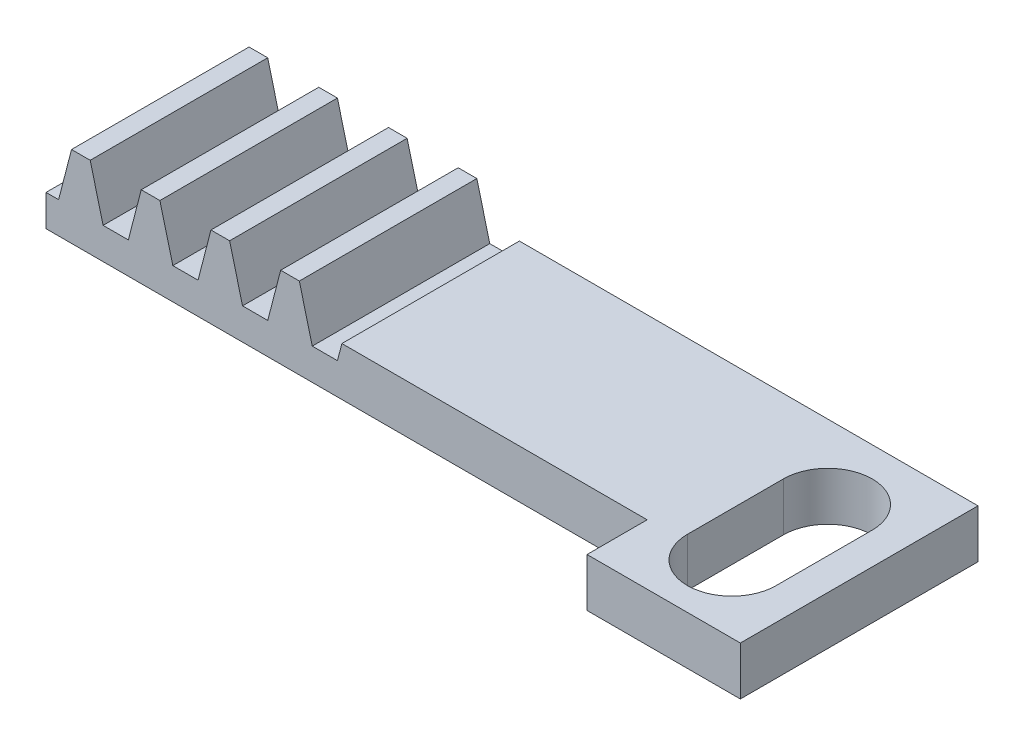
ISO-10303-21;
HEADER;
FILE_DESCRIPTION(('STEP AP214'),'2;1');
FILE_NAME('part.step','',(''),(''),'','','');
FILE_SCHEMA(('AUTOMOTIVE_DESIGN { 1 0 10303 214 1 1 1 1 }'));
ENDSEC;
DATA;
#1=APPLICATION_CONTEXT('core data for automotive mechanical design processes');
#2=APPLICATION_PROTOCOL_DEFINITION('international standard','automotive_design',2000,#1);
#3=PRODUCT_CONTEXT('',#1,'mechanical');
#4=PRODUCT('Part','Part','',(#3));
#5=PRODUCT_RELATED_PRODUCT_CATEGORY('part','',(#4));
#6=PRODUCT_DEFINITION_FORMATION('','',#4);
#7=PRODUCT_DEFINITION_CONTEXT('part definition',#1,'design');
#8=PRODUCT_DEFINITION('design','',#6,#7);
#9=PRODUCT_DEFINITION_SHAPE('','',#8);
#10=(LENGTH_UNIT() NAMED_UNIT(*) SI_UNIT(.MILLI.,.METRE.));
#11=(NAMED_UNIT(*) PLANE_ANGLE_UNIT() SI_UNIT($,.RADIAN.));
#12=(NAMED_UNIT(*) SI_UNIT($,.STERADIAN.) SOLID_ANGLE_UNIT());
#13=UNCERTAINTY_MEASURE_WITH_UNIT(LENGTH_MEASURE(1.E-05),#10,'distance_accuracy_value','');
#14=(GEOMETRIC_REPRESENTATION_CONTEXT(3) GLOBAL_UNCERTAINTY_ASSIGNED_CONTEXT((#13)) GLOBAL_UNIT_ASSIGNED_CONTEXT((#10,
#11,#12)) REPRESENTATION_CONTEXT('',''));
#15=CARTESIAN_POINT('',(0.,0.,0.));
#16=DIRECTION('',(0.,0.,1.));
#17=DIRECTION('',(1.,0.,0.));
#18=AXIS2_PLACEMENT_3D('',#15,#16,#17);
#19=CARTESIAN_POINT('',(0.,5.5,-12.));
#20=DIRECTION('',(0.,1.,0.));
#21=DIRECTION('',(0.,0.,1.));
#22=AXIS2_PLACEMENT_3D('',#19,#20,#21);
#23=PLANE('',#22);
#24=DIRECTION('',(0.,0.,1.));
#25=VECTOR('',#24,1.);
#26=CARTESIAN_POINT('',(12.4121433047162,5.5,-12.));
#27=LINE('',#26,#25);
#28=CARTESIAN_POINT('',(12.4121433047162,5.5,-12.));
#29=VERTEX_POINT('',#28);
#30=CARTESIAN_POINT('',(12.4121433047162,5.5,0.));
#31=VERTEX_POINT('',#30);
#32=EDGE_CURVE('E339',#29,#31,#27,.T.);
#33=ORIENTED_EDGE('',*,*,#32,.F.);
#34=DIRECTION('',(-1.,0.,0.));
#35=VECTOR('',#34,1.);
#36=CARTESIAN_POINT('',(0.,5.5,-12.));
#37=LINE('',#36,#35);
#38=CARTESIAN_POINT('',(11.1498015702838,5.5,-12.));
#39=VERTEX_POINT('',#38);
#40=EDGE_CURVE('E416',#29,#39,#37,.T.);
#41=ORIENTED_EDGE('',*,*,#40,.T.);
#42=DIRECTION('',(0.,0.,-1.));
#43=VECTOR('',#42,1.);
#44=CARTESIAN_POINT('',(11.1498015702838,5.5,-12.));
#45=LINE('',#44,#43);
#46=CARTESIAN_POINT('',(11.1498015702838,5.5,0.));
#47=VERTEX_POINT('',#46);
#48=EDGE_CURVE('E359',#47,#39,#45,.T.);
#49=ORIENTED_EDGE('',*,*,#48,.F.);
#50=DIRECTION('',(-1.,0.,0.));
#51=VECTOR('',#50,1.);
#52=CARTESIAN_POINT('',(0.,5.5,0.));
#53=LINE('',#52,#51);
#54=EDGE_CURVE('E421',#31,#47,#53,.T.);
#55=ORIENTED_EDGE('',*,*,#54,.F.);
#56=EDGE_LOOP('',(#33,#41,#49,#55));
#57=FACE_BOUND('',#56,.T.);
#58=ADVANCED_FACE('F37',(#57),#23,.T.);
#59=DIRECTION('',(0.,0.,1.));
#60=VECTOR('',#59,1.);
#61=CARTESIAN_POINT('',(7.69975432971617,5.5,-12.));
#62=LINE('',#61,#60);
#63=CARTESIAN_POINT('',(7.69975432971617,5.5,-12.));
#64=VERTEX_POINT('',#63);
#65=CARTESIAN_POINT('',(7.69975432971617,5.5,0.));
#66=VERTEX_POINT('',#65);
#67=EDGE_CURVE('E363',#64,#66,#62,.T.);
#68=ORIENTED_EDGE('',*,*,#67,.F.);
#69=CARTESIAN_POINT('',(6.43741259528382,5.5,-12.));
#70=VERTEX_POINT('',#69);
#71=EDGE_CURVE('E460',#64,#70,#37,.T.);
#72=ORIENTED_EDGE('',*,*,#71,.T.);
#73=DIRECTION('',(0.,0.,-1.));
#74=VECTOR('',#73,1.);
#75=CARTESIAN_POINT('',(6.43741259528382,5.5,-12.));
#76=LINE('',#75,#74);
#77=CARTESIAN_POINT('',(6.43741259528382,5.5,0.));
#78=VERTEX_POINT('',#77);
#79=EDGE_CURVE('E383',#78,#70,#76,.T.);
#80=ORIENTED_EDGE('',*,*,#79,.F.);
#81=EDGE_CURVE('E444',#66,#78,#53,.T.);
#82=ORIENTED_EDGE('',*,*,#81,.F.);
#83=EDGE_LOOP('',(#68,#72,#80,#82));
#84=FACE_BOUND('',#83,.T.);
#85=ADVANCED_FACE('F475',(#84),#23,.T.);
#86=DIRECTION('',(0.,0.,1.));
#87=VECTOR('',#86,1.);
#88=CARTESIAN_POINT('',(2.98736535471617,5.5,-12.));
#89=LINE('',#88,#87);
#90=CARTESIAN_POINT('',(2.98736535471617,5.5,-12.));
#91=VERTEX_POINT('',#90);
#92=CARTESIAN_POINT('',(2.98736535471617,5.5,0.));
#93=VERTEX_POINT('',#92);
#94=EDGE_CURVE('E387',#91,#93,#89,.T.);
#95=ORIENTED_EDGE('',*,*,#94,.F.);
#96=CARTESIAN_POINT('',(1.72502362028382,5.5,-12.));
#97=VERTEX_POINT('',#96);
#98=EDGE_CURVE('E412',#91,#97,#37,.T.);
#99=ORIENTED_EDGE('',*,*,#98,.T.);
#100=DIRECTION('',(0.,0.,-1.));
#101=VECTOR('',#100,1.);
#102=CARTESIAN_POINT('',(1.72502362028382,5.5,-12.));
#103=LINE('',#102,#101);
#104=CARTESIAN_POINT('',(1.72502362028382,5.5,0.));
#105=VERTEX_POINT('',#104);
#106=EDGE_CURVE('E403',#105,#97,#103,.T.);
#107=ORIENTED_EDGE('',*,*,#106,.F.);
#108=EDGE_CURVE('E419',#93,#105,#53,.T.);
#109=ORIENTED_EDGE('',*,*,#108,.F.);
#110=EDGE_LOOP('',(#95,#99,#107,#109));
#111=FACE_BOUND('',#110,.T.);
#112=ADVANCED_FACE('F457',(#111),#23,.T.);
#113=CARTESIAN_POINT('',(0.,0.,-12.));
#114=DIRECTION('',(-1.,0.,0.));
#115=DIRECTION('',(0.,0.,1.));
#116=AXIS2_PLACEMENT_3D('',#113,#114,#115);
#117=PLANE('',#116);
#118=DIRECTION('',(0.,0.,1.));
#119=VECTOR('',#118,1.);
#120=CARTESIAN_POINT('',(0.,2.125,-12.));
#121=LINE('',#120,#119);
#122=CARTESIAN_POINT('',(0.,2.125,-12.));
#123=VERTEX_POINT('',#122);
#124=CARTESIAN_POINT('',(0.,2.125,0.));
#125=VERTEX_POINT('',#124);
#126=EDGE_CURVE('E401',#123,#125,#121,.T.);
#127=ORIENTED_EDGE('',*,*,#126,.F.);
#128=DIRECTION('',(0.,-1.,0.));
#129=VECTOR('',#128,1.);
#130=CARTESIAN_POINT('',(0.,0.,-12.));
#131=LINE('',#130,#129);
#132=CARTESIAN_POINT('',(0.,0.,-12.));
#133=VERTEX_POINT('',#132);
#134=EDGE_CURVE('E407',#123,#133,#131,.T.);
#135=ORIENTED_EDGE('',*,*,#134,.T.);
#136=DIRECTION('',(0.,0.,1.));
#137=VECTOR('',#136,1.);
#138=CARTESIAN_POINT('',(0.,0.,-12.));
#139=LINE('',#138,#137);
#140=CARTESIAN_POINT('',(0.,0.,0.));
#141=VERTEX_POINT('',#140);
#142=EDGE_CURVE('E415',#133,#141,#139,.T.);
#143=ORIENTED_EDGE('',*,*,#142,.T.);
#144=DIRECTION('',(0.,-1.,0.));
#145=VECTOR('',#144,1.);
#146=CARTESIAN_POINT('',(0.,0.,0.));
#147=LINE('',#146,#145);
#148=EDGE_CURVE('E406',#125,#141,#147,.T.);
#149=ORIENTED_EDGE('',*,*,#148,.F.);
#150=EDGE_LOOP('',(#127,#135,#143,#149));
#151=FACE_BOUND('',#150,.T.);
#152=ADVANCED_FACE('F39',(#151),#117,.T.);
#153=DIRECTION('',(0.,0.,1.));
#154=VECTOR('',#153,1.);
#155=CARTESIAN_POINT('',(17.1245322797162,5.5,-12.));
#156=LINE('',#155,#154);
#157=CARTESIAN_POINT('',(17.1245322797162,5.5,-12.));
#158=VERTEX_POINT('',#157);
#159=CARTESIAN_POINT('',(17.1245322797162,5.5,0.));
#160=VERTEX_POINT('',#159);
#161=EDGE_CURVE('E315',#158,#160,#156,.T.);
#162=ORIENTED_EDGE('',*,*,#161,.F.);
#163=CARTESIAN_POINT('',(15.8621905452838,5.5,-12.));
#164=VERTEX_POINT('',#163);
#165=EDGE_CURVE('E413',#158,#164,#37,.T.);
#166=ORIENTED_EDGE('',*,*,#165,.T.);
#167=DIRECTION('',(0.,0.,-1.));
#168=VECTOR('',#167,1.);
#169=CARTESIAN_POINT('',(15.8621905452838,5.5,-12.));
#170=LINE('',#169,#168);
#171=CARTESIAN_POINT('',(15.8621905452838,5.5,0.));
#172=VERTEX_POINT('',#171);
#173=EDGE_CURVE('E335',#172,#164,#170,.T.);
#174=ORIENTED_EDGE('',*,*,#173,.F.);
#175=EDGE_CURVE('E410',#160,#172,#53,.T.);
#176=ORIENTED_EDGE('',*,*,#175,.F.);
#177=EDGE_LOOP('',(#162,#166,#174,#176));
#178=FACE_BOUND('',#177,.T.);
#179=ADVANCED_FACE('F498',(#178),#23,.T.);
#180=CARTESIAN_POINT('',(0.,0.,-12.));
#181=DIRECTION('',(0.,-1.,0.));
#182=DIRECTION('',(0.,0.,-1.));
#183=AXIS2_PLACEMENT_3D('',#180,#181,#182);
#184=PLANE('',#183);
#185=CARTESIAN_POINT('',(45.847,0.,-0.508));
#186=DIRECTION('',(0.,1.,0.));
#187=DIRECTION('',(0.,0.,1.));
#188=AXIS2_PLACEMENT_3D('',#185,#186,#187);
#189=CIRCLE('',#188,3.);
#190=CARTESIAN_POINT('',(42.847,0.,-0.508));
#191=VERTEX_POINT('',#190);
#192=CARTESIAN_POINT('',(48.847,0.,-0.508));
#193=VERTEX_POINT('',#192);
#194=EDGE_CURVE('E245',#191,#193,#189,.T.);
#195=ORIENTED_EDGE('',*,*,#194,.T.);
#196=DIRECTION('',(0.,0.,-1.));
#197=VECTOR('',#196,1.);
#198=CARTESIAN_POINT('',(48.847,0.,-7.));
#199=LINE('',#198,#197);
#200=CARTESIAN_POINT('',(48.847,0.,-7.));
#201=VERTEX_POINT('',#200);
#202=EDGE_CURVE('E266',#193,#201,#199,.T.);
#203=ORIENTED_EDGE('',*,*,#202,.T.);
#204=CARTESIAN_POINT('',(45.847,0.,-7.));
#205=DIRECTION('',(0.,-1.,0.));
#206=DIRECTION('',(0.,0.,-1.));
#207=AXIS2_PLACEMENT_3D('',#204,#205,#206);
#208=CIRCLE('',#207,3.);
#209=CARTESIAN_POINT('',(42.847,0.,-7.));
#210=VERTEX_POINT('',#209);
#211=EDGE_CURVE('E272',#201,#210,#208,.F.);
#212=ORIENTED_EDGE('',*,*,#211,.T.);
#213=DIRECTION('',(0.,0.,1.));
#214=VECTOR('',#213,1.);
#215=CARTESIAN_POINT('',(42.847,0.,-7.));
#216=LINE('',#215,#214);
#217=EDGE_CURVE('E279',#210,#191,#216,.T.);
#218=ORIENTED_EDGE('',*,*,#217,.T.);
#219=EDGE_LOOP('',(#195,#203,#212,#218));
#220=FACE_BOUND('',#219,.T.);
#221=DIRECTION('',(1.,0.,0.));
#222=VECTOR('',#221,1.);
#223=CARTESIAN_POINT('',(0.,0.,0.));
#224=LINE('',#223,#222);
#225=CARTESIAN_POINT('',(40.6367751610148,0.,0.));
#226=VERTEX_POINT('',#225);
#227=EDGE_CURVE('E52',#141,#226,#224,.T.);
#228=ORIENTED_EDGE('',*,*,#227,.F.);
#229=ORIENTED_EDGE('',*,*,#142,.F.);
#230=DIRECTION('',(1.,0.,0.));
#231=VECTOR('',#230,1.);
#232=CARTESIAN_POINT('',(0.,0.,-12.));
#233=LINE('',#232,#231);
#234=CARTESIAN_POINT('',(51.,0.,-12.));
#235=VERTEX_POINT('',#234);
#236=EDGE_CURVE('E409',#133,#235,#233,.T.);
#237=ORIENTED_EDGE('',*,*,#236,.T.);
#238=DIRECTION('',(0.,0.,-1.));
#239=VECTOR('',#238,1.);
#240=CARTESIAN_POINT('',(51.,0.,0.));
#241=LINE('',#240,#239);
#242=CARTESIAN_POINT('',(51.,0.,4.064));
#243=VERTEX_POINT('',#242);
#244=EDGE_CURVE('E282',#243,#235,#241,.T.);
#245=ORIENTED_EDGE('',*,*,#244,.F.);
#246=DIRECTION('',(1.,0.,0.));
#247=VECTOR('',#246,1.);
#248=CARTESIAN_POINT('',(0.,0.,4.064));
#249=LINE('',#248,#247);
#250=CARTESIAN_POINT('',(40.6367751610148,0.,4.064));
#251=VERTEX_POINT('',#250);
#252=EDGE_CURVE('E255',#251,#243,#249,.T.);
#253=ORIENTED_EDGE('',*,*,#252,.F.);
#254=DIRECTION('',(0.,0.,1.));
#255=VECTOR('',#254,1.);
#256=CARTESIAN_POINT('',(40.6367751610148,0.,0.));
#257=LINE('',#256,#255);
#258=EDGE_CURVE('E251',#226,#251,#257,.T.);
#259=ORIENTED_EDGE('',*,*,#258,.F.);
#260=EDGE_LOOP('',(#228,#229,#237,#245,#253,#259));
#261=FACE_BOUND('',#260,.T.);
#262=ADVANCED_FACE('F504',(#220,#261),#184,.T.);
#263=CARTESIAN_POINT('',(0.,5.5,-12.));
#264=DIRECTION('',(0.,0.,-1.));
#265=DIRECTION('',(-1.,0.,0.));
#266=AXIS2_PLACEMENT_3D('',#263,#264,#265);
#267=PLANE('',#266);
#268=DIRECTION('',(0.250380004054435,-0.968147640378109,0.));
#269=VECTOR('',#268,1.);
#270=CARTESIAN_POINT('',(17.1179633930735,5.5254,-12.));
#271=LINE('',#270,#269);
#272=CARTESIAN_POINT('',(17.9973666269173,2.125,-12.));
#273=VERTEX_POINT('',#272);
#274=EDGE_CURVE('E295',#158,#273,#271,.T.);
#275=ORIENTED_EDGE('',*,*,#274,.T.);
#276=DIRECTION('',(1.,0.,0.));
#277=VECTOR('',#276,1.);
#278=CARTESIAN_POINT('',(19.7017451730827,2.125,-12.));
#279=LINE('',#278,#277);
#280=CARTESIAN_POINT('',(19.7017451730827,2.125,-12.));
#281=VERTEX_POINT('',#280);
#282=EDGE_CURVE('E298',#273,#281,#279,.T.);
#283=ORIENTED_EDGE('',*,*,#282,.T.);
#284=DIRECTION('',(0.250380004054435,0.968147640378109,0.));
#285=VECTOR('',#284,1.);
#286=CARTESIAN_POINT('',(20.5811484069265,5.5254,-12.));
#287=LINE('',#286,#285);
#288=CARTESIAN_POINT('',(20.,3.2782658448579,-12.));
#289=VERTEX_POINT('',#288);
#290=EDGE_CURVE('E302',#281,#289,#287,.T.);
#291=ORIENTED_EDGE('',*,*,#290,.T.);
#292=DIRECTION('',(-1.,0.,0.));
#293=VECTOR('',#292,1.);
#294=CARTESIAN_POINT('',(51.,3.2782658448579,-12.));
#295=LINE('',#294,#293);
#296=CARTESIAN_POINT('',(51.,3.2782658448579,-12.));
#297=VERTEX_POINT('',#296);
#298=EDGE_CURVE('E291',#297,#289,#295,.T.);
#299=ORIENTED_EDGE('',*,*,#298,.F.);
#300=DIRECTION('',(0.,1.,0.));
#301=VECTOR('',#300,1.);
#302=CARTESIAN_POINT('',(51.,3.2782658448579,-12.));
#303=LINE('',#302,#301);
#304=EDGE_CURVE('E285',#235,#297,#303,.T.);
#305=ORIENTED_EDGE('',*,*,#304,.F.);
#306=ORIENTED_EDGE('',*,*,#236,.F.);
#307=ORIENTED_EDGE('',*,*,#134,.F.);
#308=DIRECTION('',(1.,0.,0.));
#309=VECTOR('',#308,1.);
#310=CARTESIAN_POINT('',(0.852189273082719,2.125,-12.));
#311=LINE('',#310,#309);
#312=CARTESIAN_POINT('',(0.852189273082719,2.125,-12.));
#313=VERTEX_POINT('',#312);
#314=EDGE_CURVE('E390',#123,#313,#311,.T.);
#315=ORIENTED_EDGE('',*,*,#314,.T.);
#316=DIRECTION('',(0.250380004054435,0.968147640378109,0.));
#317=VECTOR('',#316,1.);
#318=CARTESIAN_POINT('',(1.73159250692646,5.5254,-12.));
#319=LINE('',#318,#317);
#320=EDGE_CURVE('E393',#313,#97,#319,.T.);
#321=ORIENTED_EDGE('',*,*,#320,.T.);
#322=ORIENTED_EDGE('',*,*,#98,.F.);
#323=DIRECTION('',(0.250380004054435,-0.968147640378109,0.));
#324=VECTOR('',#323,1.);
#325=CARTESIAN_POINT('',(2.98079646807353,5.5254,-12.));
#326=LINE('',#325,#324);
#327=CARTESIAN_POINT('',(3.86019970191728,2.125,-12.));
#328=VERTEX_POINT('',#327);
#329=EDGE_CURVE('E366',#91,#328,#326,.T.);
#330=ORIENTED_EDGE('',*,*,#329,.T.);
#331=DIRECTION('',(1.,0.,0.));
#332=VECTOR('',#331,1.);
#333=CARTESIAN_POINT('',(5.56457824808272,2.125,-12.));
#334=LINE('',#333,#332);
#335=CARTESIAN_POINT('',(5.56457824808272,2.125,-12.));
#336=VERTEX_POINT('',#335);
#337=EDGE_CURVE('E369',#328,#336,#334,.T.);
#338=ORIENTED_EDGE('',*,*,#337,.T.);
#339=DIRECTION('',(0.250380004054435,0.968147640378109,0.));
#340=VECTOR('',#339,1.);
#341=CARTESIAN_POINT('',(6.44398148192646,5.5254,-12.));
#342=LINE('',#341,#340);
#343=EDGE_CURVE('E373',#336,#70,#342,.T.);
#344=ORIENTED_EDGE('',*,*,#343,.T.);
#345=ORIENTED_EDGE('',*,*,#71,.F.);
#346=DIRECTION('',(0.250380004054435,-0.968147640378109,0.));
#347=VECTOR('',#346,1.);
#348=CARTESIAN_POINT('',(7.69318544307353,5.5254,-12.));
#349=LINE('',#348,#347);
#350=CARTESIAN_POINT('',(8.57258867691728,2.125,-12.));
#351=VERTEX_POINT('',#350);
#352=EDGE_CURVE('E342',#64,#351,#349,.T.);
#353=ORIENTED_EDGE('',*,*,#352,.T.);
#354=DIRECTION('',(1.,0.,0.));
#355=VECTOR('',#354,1.);
#356=CARTESIAN_POINT('',(10.2769672230827,2.125,-12.));
#357=LINE('',#356,#355);
#358=CARTESIAN_POINT('',(10.2769672230827,2.125,-12.));
#359=VERTEX_POINT('',#358);
#360=EDGE_CURVE('E345',#351,#359,#357,.T.);
#361=ORIENTED_EDGE('',*,*,#360,.T.);
#362=DIRECTION('',(0.250380004054435,0.968147640378109,0.));
#363=VECTOR('',#362,1.);
#364=CARTESIAN_POINT('',(11.1563704569265,5.5254,-12.));
#365=LINE('',#364,#363);
#366=EDGE_CURVE('E349',#359,#39,#365,.T.);
#367=ORIENTED_EDGE('',*,*,#366,.T.);
#368=ORIENTED_EDGE('',*,*,#40,.F.);
#369=DIRECTION('',(0.250380004054435,-0.968147640378109,0.));
#370=VECTOR('',#369,1.);
#371=CARTESIAN_POINT('',(12.4055744180735,5.5254,-12.));
#372=LINE('',#371,#370);
#373=CARTESIAN_POINT('',(13.2849776519173,2.125,-12.));
#374=VERTEX_POINT('',#373);
#375=EDGE_CURVE('E318',#29,#374,#372,.T.);
#376=ORIENTED_EDGE('',*,*,#375,.T.);
#377=DIRECTION('',(1.,0.,0.));
#378=VECTOR('',#377,1.);
#379=CARTESIAN_POINT('',(14.9893561980827,2.125,-12.));
#380=LINE('',#379,#378);
#381=CARTESIAN_POINT('',(14.9893561980827,2.125,-12.));
#382=VERTEX_POINT('',#381);
#383=EDGE_CURVE('E321',#374,#382,#380,.T.);
#384=ORIENTED_EDGE('',*,*,#383,.T.);
#385=DIRECTION('',(0.250380004054435,0.968147640378109,0.));
#386=VECTOR('',#385,1.);
#387=CARTESIAN_POINT('',(15.8687594319265,5.5254,-12.));
#388=LINE('',#387,#386);
#389=EDGE_CURVE('E325',#382,#164,#388,.T.);
#390=ORIENTED_EDGE('',*,*,#389,.T.);
#391=ORIENTED_EDGE('',*,*,#165,.F.);
#392=EDGE_LOOP('',(#275,#283,#291,#299,#305,#306,#307,#315,#321,#322,#330,#338,#344,#345,#353,
#361,#367,#368,#376,#384,#390,#391));
#393=FACE_BOUND('',#392,.T.);
#394=ADVANCED_FACE('F468',(#393),#267,.T.);
#395=CARTESIAN_POINT('',(0.,5.5,0.));
#396=DIRECTION('',(0.,0.,-1.));
#397=DIRECTION('',(-1.,0.,0.));
#398=AXIS2_PLACEMENT_3D('',#395,#396,#397);
#399=PLANE('',#398);
#400=ORIENTED_EDGE('',*,*,#227,.T.);
#401=DIRECTION('',(0.,1.,0.));
#402=VECTOR('',#401,1.);
#403=CARTESIAN_POINT('',(40.6367751610148,0.,0.));
#404=LINE('',#403,#402);
#405=CARTESIAN_POINT('',(40.6367751610148,3.2782658448579,0.));
#406=VERTEX_POINT('',#405);
#407=EDGE_CURVE('E257',#226,#406,#404,.T.);
#408=ORIENTED_EDGE('',*,*,#407,.T.);
#409=DIRECTION('',(-1.,0.,0.));
#410=VECTOR('',#409,1.);
#411=CARTESIAN_POINT('',(51.,3.2782658448579,0.));
#412=LINE('',#411,#410);
#413=CARTESIAN_POINT('',(20.,3.2782658448579,0.));
#414=VERTEX_POINT('',#413);
#415=EDGE_CURVE('E289',#406,#414,#412,.T.);
#416=ORIENTED_EDGE('',*,*,#415,.T.);
#417=DIRECTION('',(0.250380004054435,0.968147640378109,0.));
#418=VECTOR('',#417,1.);
#419=CARTESIAN_POINT('',(20.5811484069265,5.5254,0.));
#420=LINE('',#419,#418);
#421=CARTESIAN_POINT('',(19.7017451730827,2.125,0.));
#422=VERTEX_POINT('',#421);
#423=EDGE_CURVE('E299',#422,#414,#420,.T.);
#424=ORIENTED_EDGE('',*,*,#423,.F.);
#425=DIRECTION('',(1.,0.,0.));
#426=VECTOR('',#425,1.);
#427=CARTESIAN_POINT('',(19.7017451730827,2.125,0.));
#428=LINE('',#427,#426);
#429=CARTESIAN_POINT('',(17.9973666269173,2.125,0.));
#430=VERTEX_POINT('',#429);
#431=EDGE_CURVE('E294',#430,#422,#428,.T.);
#432=ORIENTED_EDGE('',*,*,#431,.F.);
#433=DIRECTION('',(-0.250380004054435,0.968147640378109,0.));
#434=VECTOR('',#433,1.);
#435=CARTESIAN_POINT('',(16.0509928435504,9.65106899571257,0.));
#436=LINE('',#435,#434);
#437=EDGE_CURVE('E11',#430,#160,#436,.T.);
#438=ORIENTED_EDGE('',*,*,#437,.T.);
#439=ORIENTED_EDGE('',*,*,#175,.T.);
#440=DIRECTION('',(0.250380004054435,0.968147640378109,0.));
#441=VECTOR('',#440,1.);
#442=CARTESIAN_POINT('',(15.8687594319265,5.5254,0.));
#443=LINE('',#442,#441);
#444=CARTESIAN_POINT('',(14.9893561980827,2.125,0.));
#445=VERTEX_POINT('',#444);
#446=EDGE_CURVE('E322',#445,#172,#443,.T.);
#447=ORIENTED_EDGE('',*,*,#446,.F.);
#448=DIRECTION('',(1.,0.,0.));
#449=VECTOR('',#448,1.);
#450=CARTESIAN_POINT('',(14.9893561980827,2.125,0.));
#451=LINE('',#450,#449);
#452=CARTESIAN_POINT('',(13.2849776519173,2.125,0.));
#453=VERTEX_POINT('',#452);
#454=EDGE_CURVE('E317',#453,#445,#451,.T.);
#455=ORIENTED_EDGE('',*,*,#454,.F.);
#456=DIRECTION('',(-0.250380004054435,0.968147640378109,0.));
#457=VECTOR('',#456,1.);
#458=CARTESIAN_POINT('',(11.6340242234297,8.50876324100121,0.));
#459=LINE('',#458,#457);
#460=EDGE_CURVE('E45',#453,#31,#459,.T.);
#461=ORIENTED_EDGE('',*,*,#460,.T.);
#462=ORIENTED_EDGE('',*,*,#54,.T.);
#463=DIRECTION('',(0.250380004054435,0.968147640378109,0.));
#464=VECTOR('',#463,1.);
#465=CARTESIAN_POINT('',(11.1563704569265,5.5254,0.));
#466=LINE('',#465,#464);
#467=CARTESIAN_POINT('',(10.2769672230827,2.125,0.));
#468=VERTEX_POINT('',#467);
#469=EDGE_CURVE('E346',#468,#47,#466,.T.);
#470=ORIENTED_EDGE('',*,*,#469,.F.);
#471=DIRECTION('',(1.,0.,0.));
#472=VECTOR('',#471,1.);
#473=CARTESIAN_POINT('',(10.2769672230827,2.125,0.));
#474=LINE('',#473,#472);
#475=CARTESIAN_POINT('',(8.57258867691728,2.125,0.));
#476=VERTEX_POINT('',#475);
#477=EDGE_CURVE('E341',#476,#468,#474,.T.);
#478=ORIENTED_EDGE('',*,*,#477,.F.);
#479=DIRECTION('',(-0.250380004054435,0.968147640378109,0.));
#480=VECTOR('',#479,1.);
#481=CARTESIAN_POINT('',(7.21705560330894,7.36645748628985,0.));
#482=LINE('',#481,#480);
#483=EDGE_CURVE('E430',#476,#66,#482,.T.);
#484=ORIENTED_EDGE('',*,*,#483,.T.);
#485=ORIENTED_EDGE('',*,*,#81,.T.);
#486=DIRECTION('',(0.250380004054435,0.968147640378109,0.));
#487=VECTOR('',#486,1.);
#488=CARTESIAN_POINT('',(6.44398148192646,5.5254,0.));
#489=LINE('',#488,#487);
#490=CARTESIAN_POINT('',(5.56457824808272,2.125,0.));
#491=VERTEX_POINT('',#490);
#492=EDGE_CURVE('E370',#491,#78,#489,.T.);
#493=ORIENTED_EDGE('',*,*,#492,.F.);
#494=DIRECTION('',(1.,0.,0.));
#495=VECTOR('',#494,1.);
#496=CARTESIAN_POINT('',(5.56457824808272,2.125,0.));
#497=LINE('',#496,#495);
#498=CARTESIAN_POINT('',(3.86019970191728,2.125,0.));
#499=VERTEX_POINT('',#498);
#500=EDGE_CURVE('E365',#499,#491,#497,.T.);
#501=ORIENTED_EDGE('',*,*,#500,.F.);
#502=DIRECTION('',(-0.250380004054435,0.968147640378109,0.));
#503=VECTOR('',#502,1.);
#504=CARTESIAN_POINT('',(2.80008698318822,6.22415173157849,0.));
#505=LINE('',#504,#503);
#506=EDGE_CURVE('E427',#499,#93,#505,.T.);
#507=ORIENTED_EDGE('',*,*,#506,.T.);
#508=ORIENTED_EDGE('',*,*,#108,.T.);
#509=DIRECTION('',(0.250380004054435,0.968147640378109,0.));
#510=VECTOR('',#509,1.);
#511=CARTESIAN_POINT('',(1.73159250692646,5.5254,0.));
#512=LINE('',#511,#510);
#513=CARTESIAN_POINT('',(0.852189273082719,2.125,0.));
#514=VERTEX_POINT('',#513);
#515=EDGE_CURVE('E389',#514,#105,#512,.T.);
#516=ORIENTED_EDGE('',*,*,#515,.F.);
#517=DIRECTION('',(-1.,0.,0.));
#518=VECTOR('',#517,1.);
#519=CARTESIAN_POINT('',(0.,2.125,0.));
#520=LINE('',#519,#518);
#521=EDGE_CURVE('E424',#514,#125,#520,.T.);
#522=ORIENTED_EDGE('',*,*,#521,.T.);
#523=ORIENTED_EDGE('',*,*,#148,.T.);
#524=EDGE_LOOP('',(#400,#408,#416,#424,#432,#438,#439,#447,#455,#461,#462,#470,#478,#484,#485,
#493,#501,#507,#508,#516,#522,#523));
#525=FACE_BOUND('',#524,.T.);
#526=ADVANCED_FACE('F436',(#525),#399,.F.);
#527=CARTESIAN_POINT('',(1.73159250692646,5.5254,-12.));
#528=DIRECTION('',(0.968147640378109,-0.250380004054435,0.));
#529=DIRECTION('',(0.250380004054435,0.968147640378109,0.));
#530=AXIS2_PLACEMENT_3D('',#527,#528,#529);
#531=PLANE('',#530);
#532=ORIENTED_EDGE('',*,*,#106,.T.);
#533=ORIENTED_EDGE('',*,*,#320,.F.);
#534=DIRECTION('',(0.,0.,1.));
#535=VECTOR('',#534,1.);
#536=CARTESIAN_POINT('',(0.852189273082719,2.125,-12.));
#537=LINE('',#536,#535);
#538=EDGE_CURVE('E396',#313,#514,#537,.T.);
#539=ORIENTED_EDGE('',*,*,#538,.T.);
#540=ORIENTED_EDGE('',*,*,#515,.T.);
#541=EDGE_LOOP('',(#532,#533,#539,#540));
#542=FACE_BOUND('',#541,.T.);
#543=ADVANCED_FACE('F455',(#542),#531,.F.);
#544=CARTESIAN_POINT('',(0.852189273082719,2.125,-12.));
#545=DIRECTION('',(0.,-1.,0.));
#546=DIRECTION('',(0.,0.,-1.));
#547=AXIS2_PLACEMENT_3D('',#544,#545,#546);
#548=PLANE('',#547);
#549=ORIENTED_EDGE('',*,*,#126,.T.);
#550=ORIENTED_EDGE('',*,*,#521,.F.);
#551=ORIENTED_EDGE('',*,*,#538,.F.);
#552=ORIENTED_EDGE('',*,*,#314,.F.);
#553=EDGE_LOOP('',(#549,#550,#551,#552));
#554=FACE_BOUND('',#553,.T.);
#555=ADVANCED_FACE('F485',(#554),#548,.F.);
#556=CARTESIAN_POINT('',(2.98079646807353,5.5254,-12.));
#557=DIRECTION('',(-0.968147640378109,-0.250380004054435,0.));
#558=DIRECTION('',(0.250380004054435,-0.968147640378109,0.));
#559=AXIS2_PLACEMENT_3D('',#556,#557,#558);
#560=PLANE('',#559);
#561=ORIENTED_EDGE('',*,*,#94,.T.);
#562=ORIENTED_EDGE('',*,*,#506,.F.);
#563=DIRECTION('',(0.,0.,1.));
#564=VECTOR('',#563,1.);
#565=CARTESIAN_POINT('',(3.86019970191728,2.125,-12.));
#566=LINE('',#565,#564);
#567=EDGE_CURVE('E376',#328,#499,#566,.T.);
#568=ORIENTED_EDGE('',*,*,#567,.F.);
#569=ORIENTED_EDGE('',*,*,#329,.F.);
#570=EDGE_LOOP('',(#561,#562,#568,#569));
#571=FACE_BOUND('',#570,.T.);
#572=ADVANCED_FACE('F483',(#571),#560,.F.);
#573=CARTESIAN_POINT('',(6.44398148192646,5.5254,-12.));
#574=DIRECTION('',(0.968147640378109,-0.250380004054435,0.));
#575=DIRECTION('',(0.250380004054435,0.968147640378109,0.));
#576=AXIS2_PLACEMENT_3D('',#573,#574,#575);
#577=PLANE('',#576);
#578=ORIENTED_EDGE('',*,*,#79,.T.);
#579=ORIENTED_EDGE('',*,*,#343,.F.);
#580=DIRECTION('',(0.,0.,1.));
#581=VECTOR('',#580,1.);
#582=CARTESIAN_POINT('',(5.56457824808272,2.125,-12.));
#583=LINE('',#582,#581);
#584=EDGE_CURVE('E381',#336,#491,#583,.T.);
#585=ORIENTED_EDGE('',*,*,#584,.T.);
#586=ORIENTED_EDGE('',*,*,#492,.T.);
#587=EDGE_LOOP('',(#578,#579,#585,#586));
#588=FACE_BOUND('',#587,.T.);
#589=ADVANCED_FACE('F478',(#588),#577,.F.);
#590=CARTESIAN_POINT('',(5.56457824808272,2.125,-12.));
#591=DIRECTION('',(0.,-1.,0.));
#592=DIRECTION('',(0.,0.,-1.));
#593=AXIS2_PLACEMENT_3D('',#590,#591,#592);
#594=PLANE('',#593);
#595=ORIENTED_EDGE('',*,*,#500,.T.);
#596=ORIENTED_EDGE('',*,*,#584,.F.);
#597=ORIENTED_EDGE('',*,*,#337,.F.);
#598=ORIENTED_EDGE('',*,*,#567,.T.);
#599=EDGE_LOOP('',(#595,#596,#597,#598));
#600=FACE_BOUND('',#599,.T.);
#601=ADVANCED_FACE('F481',(#600),#594,.F.);
#602=CARTESIAN_POINT('',(7.69318544307353,5.5254,-12.));
#603=DIRECTION('',(-0.968147640378109,-0.250380004054435,0.));
#604=DIRECTION('',(0.250380004054435,-0.968147640378109,0.));
#605=AXIS2_PLACEMENT_3D('',#602,#603,#604);
#606=PLANE('',#605);
#607=ORIENTED_EDGE('',*,*,#67,.T.);
#608=ORIENTED_EDGE('',*,*,#483,.F.);
#609=DIRECTION('',(0.,0.,1.));
#610=VECTOR('',#609,1.);
#611=CARTESIAN_POINT('',(8.57258867691728,2.125,-12.));
#612=LINE('',#611,#610);
#613=EDGE_CURVE('E352',#351,#476,#612,.T.);
#614=ORIENTED_EDGE('',*,*,#613,.F.);
#615=ORIENTED_EDGE('',*,*,#352,.F.);
#616=EDGE_LOOP('',(#607,#608,#614,#615));
#617=FACE_BOUND('',#616,.T.);
#618=ADVANCED_FACE('F567',(#617),#606,.F.);
#619=CARTESIAN_POINT('',(11.1563704569265,5.5254,-12.));
#620=DIRECTION('',(0.968147640378109,-0.250380004054435,0.));
#621=DIRECTION('',(0.250380004054435,0.968147640378109,0.));
#622=AXIS2_PLACEMENT_3D('',#619,#620,#621);
#623=PLANE('',#622);
#624=ORIENTED_EDGE('',*,*,#48,.T.);
#625=ORIENTED_EDGE('',*,*,#366,.F.);
#626=DIRECTION('',(0.,0.,1.));
#627=VECTOR('',#626,1.);
#628=CARTESIAN_POINT('',(10.2769672230827,2.125,-12.));
#629=LINE('',#628,#627);
#630=EDGE_CURVE('E357',#359,#468,#629,.T.);
#631=ORIENTED_EDGE('',*,*,#630,.T.);
#632=ORIENTED_EDGE('',*,*,#469,.T.);
#633=EDGE_LOOP('',(#624,#625,#631,#632));
#634=FACE_BOUND('',#633,.T.);
#635=ADVANCED_FACE('F467',(#634),#623,.F.);
#636=CARTESIAN_POINT('',(10.2769672230827,2.125,-12.));
#637=DIRECTION('',(0.,-1.,0.));
#638=DIRECTION('',(0.,0.,-1.));
#639=AXIS2_PLACEMENT_3D('',#636,#637,#638);
#640=PLANE('',#639);
#641=ORIENTED_EDGE('',*,*,#477,.T.);
#642=ORIENTED_EDGE('',*,*,#630,.F.);
#643=ORIENTED_EDGE('',*,*,#360,.F.);
#644=ORIENTED_EDGE('',*,*,#613,.T.);
#645=EDGE_LOOP('',(#641,#642,#643,#644));
#646=FACE_BOUND('',#645,.T.);
#647=ADVANCED_FACE('F471',(#646),#640,.F.);
#648=CARTESIAN_POINT('',(12.4055744180735,5.5254,-12.));
#649=DIRECTION('',(-0.968147640378109,-0.250380004054435,0.));
#650=DIRECTION('',(0.250380004054435,-0.968147640378109,0.));
#651=AXIS2_PLACEMENT_3D('',#648,#649,#650);
#652=PLANE('',#651);
#653=ORIENTED_EDGE('',*,*,#32,.T.);
#654=ORIENTED_EDGE('',*,*,#460,.F.);
#655=DIRECTION('',(0.,0.,1.));
#656=VECTOR('',#655,1.);
#657=CARTESIAN_POINT('',(13.2849776519173,2.125,-12.));
#658=LINE('',#657,#656);
#659=EDGE_CURVE('E328',#374,#453,#658,.T.);
#660=ORIENTED_EDGE('',*,*,#659,.F.);
#661=ORIENTED_EDGE('',*,*,#375,.F.);
#662=EDGE_LOOP('',(#653,#654,#660,#661));
#663=FACE_BOUND('',#662,.T.);
#664=ADVANCED_FACE('F588',(#663),#652,.F.);
#665=CARTESIAN_POINT('',(15.8687594319265,5.5254,-12.));
#666=DIRECTION('',(0.968147640378109,-0.250380004054435,0.));
#667=DIRECTION('',(0.250380004054435,0.968147640378109,0.));
#668=AXIS2_PLACEMENT_3D('',#665,#666,#667);
#669=PLANE('',#668);
#670=ORIENTED_EDGE('',*,*,#173,.T.);
#671=ORIENTED_EDGE('',*,*,#389,.F.);
#672=DIRECTION('',(0.,0.,1.));
#673=VECTOR('',#672,1.);
#674=CARTESIAN_POINT('',(14.9893561980827,2.125,-12.));
#675=LINE('',#674,#673);
#676=EDGE_CURVE('E333',#382,#445,#675,.T.);
#677=ORIENTED_EDGE('',*,*,#676,.T.);
#678=ORIENTED_EDGE('',*,*,#446,.T.);
#679=EDGE_LOOP('',(#670,#671,#677,#678));
#680=FACE_BOUND('',#679,.T.);
#681=ADVANCED_FACE('F596',(#680),#669,.F.);
#682=CARTESIAN_POINT('',(14.9893561980827,2.125,-12.));
#683=DIRECTION('',(0.,-1.,0.));
#684=DIRECTION('',(0.,0.,-1.));
#685=AXIS2_PLACEMENT_3D('',#682,#683,#684);
#686=PLANE('',#685);
#687=ORIENTED_EDGE('',*,*,#454,.T.);
#688=ORIENTED_EDGE('',*,*,#676,.F.);
#689=ORIENTED_EDGE('',*,*,#383,.F.);
#690=ORIENTED_EDGE('',*,*,#659,.T.);
#691=EDGE_LOOP('',(#687,#688,#689,#690));
#692=FACE_BOUND('',#691,.T.);
#693=ADVANCED_FACE('F604',(#692),#686,.F.);
#694=CARTESIAN_POINT('',(17.1179633930735,5.5254,-12.));
#695=DIRECTION('',(-0.968147640378109,-0.250380004054435,0.));
#696=DIRECTION('',(0.250380004054435,-0.968147640378109,0.));
#697=AXIS2_PLACEMENT_3D('',#694,#695,#696);
#698=PLANE('',#697);
#699=ORIENTED_EDGE('',*,*,#161,.T.);
#700=ORIENTED_EDGE('',*,*,#437,.F.);
#701=DIRECTION('',(0.,0.,1.));
#702=VECTOR('',#701,1.);
#703=CARTESIAN_POINT('',(17.9973666269173,2.125,-12.));
#704=LINE('',#703,#702);
#705=EDGE_CURVE('E304',#273,#430,#704,.T.);
#706=ORIENTED_EDGE('',*,*,#705,.F.);
#707=ORIENTED_EDGE('',*,*,#274,.F.);
#708=EDGE_LOOP('',(#699,#700,#706,#707));
#709=FACE_BOUND('',#708,.T.);
#710=ADVANCED_FACE('F613',(#709),#698,.F.);
#711=CARTESIAN_POINT('',(20.5811484069265,5.5254,-12.));
#712=DIRECTION('',(0.968147640378109,-0.250380004054435,0.));
#713=DIRECTION('',(0.250380004054435,0.968147640378109,0.));
#714=AXIS2_PLACEMENT_3D('',#711,#712,#713);
#715=PLANE('',#714);
#716=DIRECTION('',(0.,0.,-1.));
#717=VECTOR('',#716,1.);
#718=CARTESIAN_POINT('',(20.,3.27826584485788,-12.));
#719=LINE('',#718,#717);
#720=EDGE_CURVE('E311',#414,#289,#719,.T.);
#721=ORIENTED_EDGE('',*,*,#720,.T.);
#722=ORIENTED_EDGE('',*,*,#290,.F.);
#723=DIRECTION('',(0.,0.,1.));
#724=VECTOR('',#723,1.);
#725=CARTESIAN_POINT('',(19.7017451730827,2.125,-12.));
#726=LINE('',#725,#724);
#727=EDGE_CURVE('E309',#281,#422,#726,.T.);
#728=ORIENTED_EDGE('',*,*,#727,.T.);
#729=ORIENTED_EDGE('',*,*,#423,.T.);
#730=EDGE_LOOP('',(#721,#722,#728,#729));
#731=FACE_BOUND('',#730,.T.);
#732=ADVANCED_FACE('F622',(#731),#715,.F.);
#733=CARTESIAN_POINT('',(19.7017451730827,2.125,-12.));
#734=DIRECTION('',(0.,-1.,0.));
#735=DIRECTION('',(0.,0.,-1.));
#736=AXIS2_PLACEMENT_3D('',#733,#734,#735);
#737=PLANE('',#736);
#738=ORIENTED_EDGE('',*,*,#431,.T.);
#739=ORIENTED_EDGE('',*,*,#727,.F.);
#740=ORIENTED_EDGE('',*,*,#282,.F.);
#741=ORIENTED_EDGE('',*,*,#705,.T.);
#742=EDGE_LOOP('',(#738,#739,#740,#741));
#743=FACE_BOUND('',#742,.T.);
#744=ADVANCED_FACE('F632',(#743),#737,.F.);
#745=CARTESIAN_POINT('',(51.,3.2782658448579,0.));
#746=DIRECTION('',(0.,-1.,0.));
#747=DIRECTION('',(0.,0.,-1.));
#748=AXIS2_PLACEMENT_3D('',#745,#746,#747);
#749=PLANE('',#748);
#750=DIRECTION('',(0.,0.,-1.));
#751=VECTOR('',#750,1.);
#752=CARTESIAN_POINT('',(48.847,3.2782658448579,-7.));
#753=LINE('',#752,#751);
#754=CARTESIAN_POINT('',(48.847,3.2782658448579,-0.508));
#755=VERTEX_POINT('',#754);
#756=CARTESIAN_POINT('',(48.847,3.2782658448579,-7.));
#757=VERTEX_POINT('',#756);
#758=EDGE_CURVE('E231',#755,#757,#753,.T.);
#759=ORIENTED_EDGE('',*,*,#758,.F.);
#760=CARTESIAN_POINT('',(45.847,3.2782658448579,-0.508));
#761=DIRECTION('',(0.,1.,0.));
#762=DIRECTION('',(0.,0.,1.));
#763=AXIS2_PLACEMENT_3D('',#760,#761,#762);
#764=CIRCLE('',#763,3.);
#765=CARTESIAN_POINT('',(42.847,3.2782658448579,-0.508));
#766=VERTEX_POINT('',#765);
#767=EDGE_CURVE('E234',#766,#755,#764,.T.);
#768=ORIENTED_EDGE('',*,*,#767,.F.);
#769=DIRECTION('',(0.,0.,1.));
#770=VECTOR('',#769,1.);
#771=CARTESIAN_POINT('',(42.847,3.2782658448579,-7.));
#772=LINE('',#771,#770);
#773=CARTESIAN_POINT('',(42.847,3.2782658448579,-7.));
#774=VERTEX_POINT('',#773);
#775=EDGE_CURVE('E224',#774,#766,#772,.T.);
#776=ORIENTED_EDGE('',*,*,#775,.F.);
#777=CARTESIAN_POINT('',(45.847,3.2782658448579,-7.));
#778=DIRECTION('',(0.,1.,0.));
#779=DIRECTION('',(0.,0.,1.));
#780=AXIS2_PLACEMENT_3D('',#777,#778,#779);
#781=CIRCLE('',#780,3.);
#782=EDGE_CURVE('E60',#757,#774,#781,.T.);
#783=ORIENTED_EDGE('',*,*,#782,.F.);
#784=EDGE_LOOP('',(#759,#768,#776,#783));
#785=FACE_BOUND('',#784,.T.);
#786=ORIENTED_EDGE('',*,*,#720,.F.);
#787=ORIENTED_EDGE('',*,*,#415,.F.);
#788=DIRECTION('',(0.,0.,1.));
#789=VECTOR('',#788,1.);
#790=CARTESIAN_POINT('',(40.6367751610148,3.2782658448579,0.));
#791=LINE('',#790,#789);
#792=CARTESIAN_POINT('',(40.6367751610148,3.2782658448579,4.064));
#793=VERTEX_POINT('',#792);
#794=EDGE_CURVE('E241',#406,#793,#791,.T.);
#795=ORIENTED_EDGE('',*,*,#794,.T.);
#796=DIRECTION('',(1.,0.,0.));
#797=VECTOR('',#796,1.);
#798=CARTESIAN_POINT('',(0.,3.2782658448579,4.064));
#799=LINE('',#798,#797);
#800=CARTESIAN_POINT('',(51.,3.2782658448579,4.064));
#801=VERTEX_POINT('',#800);
#802=EDGE_CURVE('E252',#793,#801,#799,.T.);
#803=ORIENTED_EDGE('',*,*,#802,.T.);
#804=DIRECTION('',(0.,0.,1.));
#805=VECTOR('',#804,1.);
#806=CARTESIAN_POINT('',(51.,3.2782658448579,0.));
#807=LINE('',#806,#805);
#808=EDGE_CURVE('E287',#297,#801,#807,.T.);
#809=ORIENTED_EDGE('',*,*,#808,.F.);
#810=ORIENTED_EDGE('',*,*,#298,.T.);
#811=EDGE_LOOP('',(#786,#787,#795,#803,#809,#810));
#812=FACE_BOUND('',#811,.T.);
#813=ADVANCED_FACE('F235',(#785,#812),#749,.F.);
#814=CARTESIAN_POINT('',(51.,0.,0.));
#815=DIRECTION('',(1.,0.,0.));
#816=DIRECTION('',(0.,0.,-1.));
#817=AXIS2_PLACEMENT_3D('',#814,#815,#816);
#818=PLANE('',#817);
#819=ORIENTED_EDGE('',*,*,#808,.T.);
#820=DIRECTION('',(0.,1.,0.));
#821=VECTOR('',#820,1.);
#822=CARTESIAN_POINT('',(51.,0.,4.064));
#823=LINE('',#822,#821);
#824=EDGE_CURVE('E263',#243,#801,#823,.T.);
#825=ORIENTED_EDGE('',*,*,#824,.F.);
#826=ORIENTED_EDGE('',*,*,#244,.T.);
#827=ORIENTED_EDGE('',*,*,#304,.T.);
#828=EDGE_LOOP('',(#819,#825,#826,#827));
#829=FACE_BOUND('',#828,.T.);
#830=ADVANCED_FACE('F678',(#829),#818,.T.);
#831=CARTESIAN_POINT('',(45.847,-0.00100000000000013,-7.));
#832=DIRECTION('',(0.,1.,0.));
#833=DIRECTION('',(0.,0.,1.));
#834=AXIS2_PLACEMENT_3D('',#831,#832,#833);
#835=CYLINDRICAL_SURFACE('',#834,3.);
#836=DIRECTION('',(0.,1.,0.));
#837=VECTOR('',#836,1.);
#838=CARTESIAN_POINT('',(48.847,-0.00100000000000013,-7.));
#839=LINE('',#838,#837);
#840=EDGE_CURVE('E277',#201,#757,#839,.T.);
#841=ORIENTED_EDGE('',*,*,#840,.T.);
#842=ORIENTED_EDGE('',*,*,#782,.T.);
#843=DIRECTION('',(0.,1.,0.));
#844=VECTOR('',#843,1.);
#845=CARTESIAN_POINT('',(42.847,-0.00100000000000013,-7.));
#846=LINE('',#845,#844);
#847=EDGE_CURVE('E229',#210,#774,#846,.T.);
#848=ORIENTED_EDGE('',*,*,#847,.F.);
#849=ORIENTED_EDGE('',*,*,#211,.F.);
#850=EDGE_LOOP('',(#841,#842,#848,#849));
#851=FACE_BOUND('',#850,.T.);
#852=ADVANCED_FACE('F688',(#851),#835,.F.);
#853=CARTESIAN_POINT('',(48.847,-0.00100000000000013,-7.));
#854=DIRECTION('',(1.,0.,0.));
#855=DIRECTION('',(0.,0.,-1.));
#856=AXIS2_PLACEMENT_3D('',#853,#854,#855);
#857=PLANE('',#856);
#858=ORIENTED_EDGE('',*,*,#202,.F.);
#859=DIRECTION('',(0.,1.,0.));
#860=VECTOR('',#859,1.);
#861=CARTESIAN_POINT('',(48.847,-19.2217341551421,-0.508));
#862=LINE('',#861,#860);
#863=EDGE_CURVE('E242',#193,#755,#862,.T.);
#864=ORIENTED_EDGE('',*,*,#863,.T.);
#865=ORIENTED_EDGE('',*,*,#758,.T.);
#866=ORIENTED_EDGE('',*,*,#840,.F.);
#867=EDGE_LOOP('',(#858,#864,#865,#866));
#868=FACE_BOUND('',#867,.T.);
#869=ADVANCED_FACE('F698',(#868),#857,.F.);
#870=CARTESIAN_POINT('',(42.847,-0.00100000000000013,-7.));
#871=DIRECTION('',(-1.,0.,0.));
#872=DIRECTION('',(0.,0.,1.));
#873=AXIS2_PLACEMENT_3D('',#870,#871,#872);
#874=PLANE('',#873);
#875=ORIENTED_EDGE('',*,*,#847,.T.);
#876=ORIENTED_EDGE('',*,*,#775,.T.);
#877=DIRECTION('',(0.,1.,0.));
#878=VECTOR('',#877,1.);
#879=CARTESIAN_POINT('',(42.847,-19.2217341551421,-0.508));
#880=LINE('',#879,#878);
#881=EDGE_CURVE('E228',#191,#766,#880,.T.);
#882=ORIENTED_EDGE('',*,*,#881,.F.);
#883=ORIENTED_EDGE('',*,*,#217,.F.);
#884=EDGE_LOOP('',(#875,#876,#882,#883));
#885=FACE_BOUND('',#884,.T.);
#886=ADVANCED_FACE('F226',(#885),#874,.F.);
#887=CARTESIAN_POINT('',(45.847,0.,-0.508));
#888=DIRECTION('',(0.,1.,0.));
#889=DIRECTION('',(0.,0.,1.));
#890=AXIS2_PLACEMENT_3D('',#887,#888,#889);
#891=CYLINDRICAL_SURFACE('',#890,3.);
#892=ORIENTED_EDGE('',*,*,#767,.T.);
#893=ORIENTED_EDGE('',*,*,#863,.F.);
#894=ORIENTED_EDGE('',*,*,#194,.F.);
#895=ORIENTED_EDGE('',*,*,#881,.T.);
#896=EDGE_LOOP('',(#892,#893,#894,#895));
#897=FACE_BOUND('',#896,.T.);
#898=ADVANCED_FACE('F244',(#897),#891,.F.);
#899=CARTESIAN_POINT('',(0.,0.,4.064));
#900=DIRECTION('',(0.,0.,1.));
#901=DIRECTION('',(1.,0.,0.));
#902=AXIS2_PLACEMENT_3D('',#899,#900,#901);
#903=PLANE('',#902);
#904=ORIENTED_EDGE('',*,*,#802,.F.);
#905=DIRECTION('',(0.,1.,0.));
#906=VECTOR('',#905,1.);
#907=CARTESIAN_POINT('',(40.6367751610148,0.,4.064));
#908=LINE('',#907,#906);
#909=EDGE_CURVE('E267',#251,#793,#908,.T.);
#910=ORIENTED_EDGE('',*,*,#909,.F.);
#911=ORIENTED_EDGE('',*,*,#252,.T.);
#912=ORIENTED_EDGE('',*,*,#824,.T.);
#913=EDGE_LOOP('',(#904,#910,#911,#912));
#914=FACE_BOUND('',#913,.T.);
#915=ADVANCED_FACE('F725',(#914),#903,.T.);
#916=CARTESIAN_POINT('',(40.6367751610148,0.,0.));
#917=DIRECTION('',(-1.,0.,0.));
#918=DIRECTION('',(0.,0.,1.));
#919=AXIS2_PLACEMENT_3D('',#916,#917,#918);
#920=PLANE('',#919);
#921=ORIENTED_EDGE('',*,*,#794,.F.);
#922=ORIENTED_EDGE('',*,*,#407,.F.);
#923=ORIENTED_EDGE('',*,*,#258,.T.);
#924=ORIENTED_EDGE('',*,*,#909,.T.);
#925=EDGE_LOOP('',(#921,#922,#923,#924));
#926=FACE_BOUND('',#925,.T.);
#927=ADVANCED_FACE('F737',(#926),#920,.T.);
#928=CLOSED_SHELL('',(#58,#85,#112,#152,#179,#262,#394,#526,#543,#555,#572,#589,#601,#618,#635,
#647,#664,#681,#693,#710,#732,#744,#813,#830,#852,#869,#886,#898,#915,#927));
#929=MANIFOLD_SOLID_BREP('B2',#928);
#930=ADVANCED_BREP_SHAPE_REPRESENTATION('',(#18,#929),#14);
#931=SHAPE_DEFINITION_REPRESENTATION(#9,#930);
ENDSEC;
END-ISO-10303-21;
